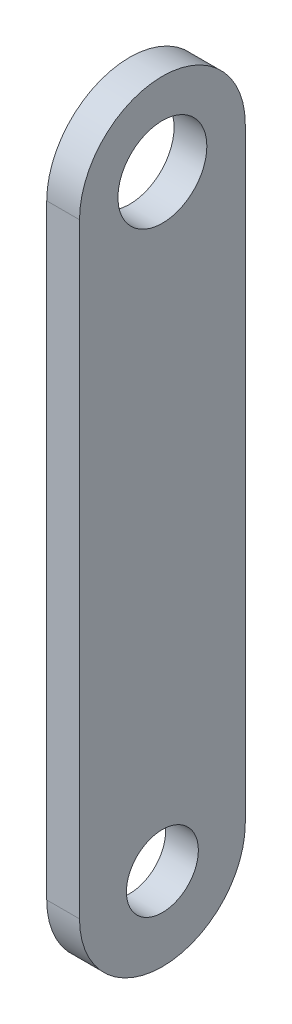
ISO-10303-21;
HEADER;
FILE_DESCRIPTION(('STEP AP214'),'2;1');
FILE_NAME('part.step','',(''),(''),'','','');
FILE_SCHEMA(('AUTOMOTIVE_DESIGN { 1 0 10303 214 1 1 1 1 }'));
ENDSEC;
DATA;
#1=APPLICATION_CONTEXT('core data for automotive mechanical design processes');
#2=APPLICATION_PROTOCOL_DEFINITION('international standard','automotive_design',2000,#1);
#3=PRODUCT_CONTEXT('',#1,'mechanical');
#4=PRODUCT('Part','Part','',(#3));
#5=PRODUCT_RELATED_PRODUCT_CATEGORY('part','',(#4));
#6=PRODUCT_DEFINITION_FORMATION('','',#4);
#7=PRODUCT_DEFINITION_CONTEXT('part definition',#1,'design');
#8=PRODUCT_DEFINITION('design','',#6,#7);
#9=PRODUCT_DEFINITION_SHAPE('','',#8);
#10=(LENGTH_UNIT() NAMED_UNIT(*) SI_UNIT(.MILLI.,.METRE.));
#11=(NAMED_UNIT(*) PLANE_ANGLE_UNIT() SI_UNIT($,.RADIAN.));
#12=(NAMED_UNIT(*) SI_UNIT($,.STERADIAN.) SOLID_ANGLE_UNIT());
#13=UNCERTAINTY_MEASURE_WITH_UNIT(LENGTH_MEASURE(1.E-05),#10,'distance_accuracy_value','');
#14=(GEOMETRIC_REPRESENTATION_CONTEXT(3) GLOBAL_UNCERTAINTY_ASSIGNED_CONTEXT((#13)) GLOBAL_UNIT_ASSIGNED_CONTEXT((#10,
#11,#12)) REPRESENTATION_CONTEXT('',''));
#15=CARTESIAN_POINT('',(0.,0.,0.));
#16=DIRECTION('',(0.,0.,1.));
#17=DIRECTION('',(1.,0.,0.));
#18=AXIS2_PLACEMENT_3D('',#15,#16,#17);
#19=CARTESIAN_POINT('',(5.,0.,0.));
#20=DIRECTION('',(1.,0.,0.));
#21=DIRECTION('',(0.,0.,-1.));
#22=AXIS2_PLACEMENT_3D('',#19,#20,#21);
#23=PLANE('',#22);
#24=CARTESIAN_POINT('',(5.,92.4,0.));
#25=DIRECTION('',(1.,0.,0.));
#26=DIRECTION('',(0.,0.,-1.));
#27=AXIS2_PLACEMENT_3D('',#24,#25,#26);
#28=CIRCLE('',#27,6.78351038224357);
#29=CARTESIAN_POINT('',(5.,92.4,-6.78351038224357));
#30=VERTEX_POINT('',#29);
#31=EDGE_CURVE('E101',#30,#30,#28,.T.);
#32=ORIENTED_EDGE('',*,*,#31,.F.);
#33=EDGE_LOOP('',(#32));
#34=FACE_BOUND('',#33,.T.);
#35=CARTESIAN_POINT('',(5.,0.,0.));
#36=DIRECTION('',(1.,0.,0.));
#37=DIRECTION('',(0.,0.,-1.));
#38=AXIS2_PLACEMENT_3D('',#35,#36,#37);
#39=CIRCLE('',#38,12.6474619479272);
#40=CARTESIAN_POINT('',(5.,0.,12.6474619479272));
#41=VERTEX_POINT('',#40);
#42=CARTESIAN_POINT('',(5.,0.,-12.6474619479272));
#43=VERTEX_POINT('',#42);
#44=EDGE_CURVE('E86',#41,#43,#39,.T.);
#45=ORIENTED_EDGE('',*,*,#44,.T.);
#46=DIRECTION('',(0.,1.,0.));
#47=VECTOR('',#46,1.);
#48=CARTESIAN_POINT('',(5.,0.,-12.6474619479272));
#49=LINE('',#48,#47);
#50=CARTESIAN_POINT('',(5.,92.4,-12.6474619479272));
#51=VERTEX_POINT('',#50);
#52=EDGE_CURVE('E81',#43,#51,#49,.T.);
#53=ORIENTED_EDGE('',*,*,#52,.T.);
#54=CARTESIAN_POINT('',(5.,92.4,0.));
#55=DIRECTION('',(1.,0.,0.));
#56=DIRECTION('',(0.,0.,-1.));
#57=AXIS2_PLACEMENT_3D('',#54,#55,#56);
#58=CIRCLE('',#57,12.6474619479272);
#59=CARTESIAN_POINT('',(5.,92.4,12.6474619479272));
#60=VERTEX_POINT('',#59);
#61=EDGE_CURVE('E84',#51,#60,#58,.T.);
#62=ORIENTED_EDGE('',*,*,#61,.T.);
#63=DIRECTION('',(0.,-1.,0.));
#64=VECTOR('',#63,1.);
#65=CARTESIAN_POINT('',(5.,0.,12.6474619479272));
#66=LINE('',#65,#64);
#67=EDGE_CURVE('E51',#60,#41,#66,.T.);
#68=ORIENTED_EDGE('',*,*,#67,.T.);
#69=EDGE_LOOP('',(#45,#53,#62,#68));
#70=FACE_BOUND('',#69,.T.);
#71=CARTESIAN_POINT('',(5.,0.,0.));
#72=DIRECTION('',(1.,0.,0.));
#73=DIRECTION('',(0.,0.,-1.));
#74=AXIS2_PLACEMENT_3D('',#71,#72,#73);
#75=CIRCLE('',#74,5.49116011658901);
#76=CARTESIAN_POINT('',(5.,0.,-5.49116011658901));
#77=VERTEX_POINT('',#76);
#78=EDGE_CURVE('E116',#77,#77,#75,.T.);
#79=ORIENTED_EDGE('',*,*,#78,.F.);
#80=EDGE_LOOP('',(#79));
#81=FACE_BOUND('',#80,.T.);
#82=ADVANCED_FACE('F34',(#34,#70,#81),#23,.T.);
#83=CARTESIAN_POINT('',(0.,0.,0.));
#84=DIRECTION('',(1.,0.,0.));
#85=DIRECTION('',(0.,0.,-1.));
#86=AXIS2_PLACEMENT_3D('',#83,#84,#85);
#87=PLANE('',#86);
#88=CARTESIAN_POINT('',(0.,0.,0.));
#89=DIRECTION('',(1.,0.,0.));
#90=DIRECTION('',(0.,0.,-1.));
#91=AXIS2_PLACEMENT_3D('',#88,#89,#90);
#92=CIRCLE('',#91,12.6474619479272);
#93=CARTESIAN_POINT('',(0.,0.,12.6474619479272));
#94=VERTEX_POINT('',#93);
#95=CARTESIAN_POINT('',(0.,0.,-12.6474619479272));
#96=VERTEX_POINT('',#95);
#97=EDGE_CURVE('E98',#94,#96,#92,.T.);
#98=ORIENTED_EDGE('',*,*,#97,.F.);
#99=DIRECTION('',(0.,-1.,0.));
#100=VECTOR('',#99,1.);
#101=CARTESIAN_POINT('',(0.,0.,12.6474619479272));
#102=LINE('',#101,#100);
#103=CARTESIAN_POINT('',(0.,92.4,12.6474619479272));
#104=VERTEX_POINT('',#103);
#105=EDGE_CURVE('E74',#104,#94,#102,.T.);
#106=ORIENTED_EDGE('',*,*,#105,.F.);
#107=CARTESIAN_POINT('',(0.,92.4,0.));
#108=DIRECTION('',(1.,0.,0.));
#109=DIRECTION('',(0.,0.,-1.));
#110=AXIS2_PLACEMENT_3D('',#107,#108,#109);
#111=CIRCLE('',#110,12.6474619479272);
#112=CARTESIAN_POINT('',(0.,92.4,-12.6474619479272));
#113=VERTEX_POINT('',#112);
#114=EDGE_CURVE('E68',#113,#104,#111,.T.);
#115=ORIENTED_EDGE('',*,*,#114,.F.);
#116=DIRECTION('',(0.,1.,0.));
#117=VECTOR('',#116,1.);
#118=CARTESIAN_POINT('',(0.,0.,-12.6474619479272));
#119=LINE('',#118,#117);
#120=EDGE_CURVE('E90',#96,#113,#119,.T.);
#121=ORIENTED_EDGE('',*,*,#120,.F.);
#122=EDGE_LOOP('',(#98,#106,#115,#121));
#123=FACE_BOUND('',#122,.T.);
#124=CARTESIAN_POINT('',(0.,92.4,0.));
#125=DIRECTION('',(1.,0.,0.));
#126=DIRECTION('',(0.,0.,-1.));
#127=AXIS2_PLACEMENT_3D('',#124,#125,#126);
#128=CIRCLE('',#127,6.78351038224357);
#129=CARTESIAN_POINT('',(0.,92.4,-6.78351038224357));
#130=VERTEX_POINT('',#129);
#131=EDGE_CURVE('E113',#130,#130,#128,.T.);
#132=ORIENTED_EDGE('',*,*,#131,.T.);
#133=EDGE_LOOP('',(#132));
#134=FACE_BOUND('',#133,.T.);
#135=CARTESIAN_POINT('',(0.,0.,0.));
#136=DIRECTION('',(1.,0.,0.));
#137=DIRECTION('',(0.,0.,-1.));
#138=AXIS2_PLACEMENT_3D('',#135,#136,#137);
#139=CIRCLE('',#138,5.49116011658901);
#140=CARTESIAN_POINT('',(0.,0.,-5.49116011658901));
#141=VERTEX_POINT('',#140);
#142=EDGE_CURVE('E119',#141,#141,#139,.T.);
#143=ORIENTED_EDGE('',*,*,#142,.T.);
#144=EDGE_LOOP('',(#143));
#145=FACE_BOUND('',#144,.T.);
#146=ADVANCED_FACE('F109',(#123,#134,#145),#87,.F.);
#147=CARTESIAN_POINT('',(5.,0.,0.));
#148=DIRECTION('',(-1.,0.,0.));
#149=DIRECTION('',(0.,0.,1.));
#150=AXIS2_PLACEMENT_3D('',#147,#148,#149);
#151=CYLINDRICAL_SURFACE('',#150,12.6474619479272);
#152=ORIENTED_EDGE('',*,*,#97,.T.);
#153=DIRECTION('',(-1.,0.,0.));
#154=VECTOR('',#153,1.);
#155=CARTESIAN_POINT('',(5.,0.,-12.6474619479272));
#156=LINE('',#155,#154);
#157=EDGE_CURVE('E11',#43,#96,#156,.T.);
#158=ORIENTED_EDGE('',*,*,#157,.F.);
#159=ORIENTED_EDGE('',*,*,#44,.F.);
#160=DIRECTION('',(-1.,0.,0.));
#161=VECTOR('',#160,1.);
#162=CARTESIAN_POINT('',(5.,0.,12.6474619479272));
#163=LINE('',#162,#161);
#164=EDGE_CURVE('E94',#41,#94,#163,.T.);
#165=ORIENTED_EDGE('',*,*,#164,.T.);
#166=EDGE_LOOP('',(#152,#158,#159,#165));
#167=FACE_BOUND('',#166,.T.);
#168=ADVANCED_FACE('F36',(#167),#151,.T.);
#169=CARTESIAN_POINT('',(5.,0.,-12.6474619479272));
#170=DIRECTION('',(0.,0.,1.));
#171=DIRECTION('',(1.,0.,0.));
#172=AXIS2_PLACEMENT_3D('',#169,#170,#171);
#173=PLANE('',#172);
#174=ORIENTED_EDGE('',*,*,#120,.T.);
#175=DIRECTION('',(-1.,0.,0.));
#176=VECTOR('',#175,1.);
#177=CARTESIAN_POINT('',(5.,92.4,-12.6474619479272));
#178=LINE('',#177,#176);
#179=EDGE_CURVE('E43',#51,#113,#178,.T.);
#180=ORIENTED_EDGE('',*,*,#179,.F.);
#181=ORIENTED_EDGE('',*,*,#52,.F.);
#182=ORIENTED_EDGE('',*,*,#157,.T.);
#183=EDGE_LOOP('',(#174,#180,#181,#182));
#184=FACE_BOUND('',#183,.T.);
#185=ADVANCED_FACE('F89',(#184),#173,.F.);
#186=CARTESIAN_POINT('',(5.,92.4,0.));
#187=DIRECTION('',(-1.,0.,0.));
#188=DIRECTION('',(0.,0.,1.));
#189=AXIS2_PLACEMENT_3D('',#186,#187,#188);
#190=CYLINDRICAL_SURFACE('',#189,12.6474619479272);
#191=ORIENTED_EDGE('',*,*,#114,.T.);
#192=DIRECTION('',(-1.,0.,0.));
#193=VECTOR('',#192,1.);
#194=CARTESIAN_POINT('',(5.,92.4,12.6474619479272));
#195=LINE('',#194,#193);
#196=EDGE_CURVE('E91',#60,#104,#195,.T.);
#197=ORIENTED_EDGE('',*,*,#196,.F.);
#198=ORIENTED_EDGE('',*,*,#61,.F.);
#199=ORIENTED_EDGE('',*,*,#179,.T.);
#200=EDGE_LOOP('',(#191,#197,#198,#199));
#201=FACE_BOUND('',#200,.T.);
#202=ADVANCED_FACE('F92',(#201),#190,.T.);
#203=CARTESIAN_POINT('',(5.,0.,12.6474619479272));
#204=DIRECTION('',(0.,0.,-1.));
#205=DIRECTION('',(-1.,0.,0.));
#206=AXIS2_PLACEMENT_3D('',#203,#204,#205);
#207=PLANE('',#206);
#208=ORIENTED_EDGE('',*,*,#105,.T.);
#209=ORIENTED_EDGE('',*,*,#164,.F.);
#210=ORIENTED_EDGE('',*,*,#67,.F.);
#211=ORIENTED_EDGE('',*,*,#196,.T.);
#212=EDGE_LOOP('',(#208,#209,#210,#211));
#213=FACE_BOUND('',#212,.T.);
#214=ADVANCED_FACE('F106',(#213),#207,.F.);
#215=CARTESIAN_POINT('',(5.,92.4,0.));
#216=DIRECTION('',(-1.,0.,0.));
#217=DIRECTION('',(0.,0.,1.));
#218=AXIS2_PLACEMENT_3D('',#215,#216,#217);
#219=CYLINDRICAL_SURFACE('',#218,6.78351038224357);
#220=ORIENTED_EDGE('',*,*,#31,.T.);
#221=EDGE_LOOP('',(#220));
#222=FACE_BOUND('',#221,.T.);
#223=ORIENTED_EDGE('',*,*,#131,.F.);
#224=EDGE_LOOP('',(#223));
#225=FACE_BOUND('',#224,.T.);
#226=ADVANCED_FACE('F136',(#222,#225),#219,.F.);
#227=CARTESIAN_POINT('',(5.,0.,0.));
#228=DIRECTION('',(-1.,0.,0.));
#229=DIRECTION('',(0.,0.,1.));
#230=AXIS2_PLACEMENT_3D('',#227,#228,#229);
#231=CYLINDRICAL_SURFACE('',#230,5.49116011658901);
#232=ORIENTED_EDGE('',*,*,#78,.T.);
#233=EDGE_LOOP('',(#232));
#234=FACE_BOUND('',#233,.T.);
#235=ORIENTED_EDGE('',*,*,#142,.F.);
#236=EDGE_LOOP('',(#235));
#237=FACE_BOUND('',#236,.T.);
#238=ADVANCED_FACE('F125',(#234,#237),#231,.F.);
#239=CLOSED_SHELL('',(#82,#146,#168,#185,#202,#214,#226,#238));
#240=MANIFOLD_SOLID_BREP('B2',#239);
#241=ADVANCED_BREP_SHAPE_REPRESENTATION('',(#18,#240),#14);
#242=SHAPE_DEFINITION_REPRESENTATION(#9,#241);
ENDSEC;
END-ISO-10303-21;
